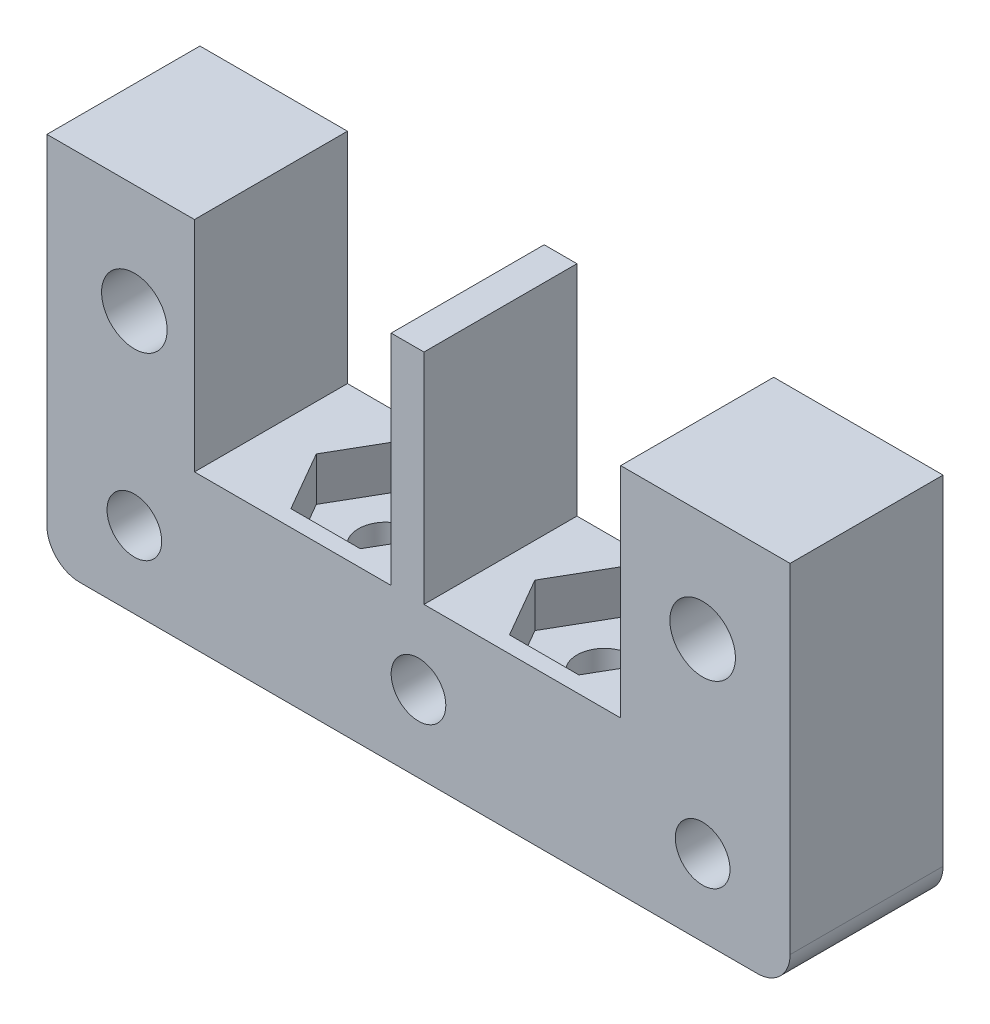
ISO-10303-21;
HEADER;
FILE_DESCRIPTION(('STEP AP214'),'2;1');
FILE_NAME('part.step','',(''),(''),'','','');
FILE_SCHEMA(('AUTOMOTIVE_DESIGN { 1 0 10303 214 1 1 1 1 }'));
ENDSEC;
DATA;
#1=APPLICATION_CONTEXT('core data for automotive mechanical design processes');
#2=APPLICATION_PROTOCOL_DEFINITION('international standard','automotive_design',2000,#1);
#3=PRODUCT_CONTEXT('',#1,'mechanical');
#4=PRODUCT('Part','Part','',(#3));
#5=PRODUCT_RELATED_PRODUCT_CATEGORY('part','',(#4));
#6=PRODUCT_DEFINITION_FORMATION('','',#4);
#7=PRODUCT_DEFINITION_CONTEXT('part definition',#1,'design');
#8=PRODUCT_DEFINITION('design','',#6,#7);
#9=PRODUCT_DEFINITION_SHAPE('','',#8);
#10=(LENGTH_UNIT() NAMED_UNIT(*) SI_UNIT(.MILLI.,.METRE.));
#11=(NAMED_UNIT(*) PLANE_ANGLE_UNIT() SI_UNIT($,.RADIAN.));
#12=(NAMED_UNIT(*) SI_UNIT($,.STERADIAN.) SOLID_ANGLE_UNIT());
#13=UNCERTAINTY_MEASURE_WITH_UNIT(LENGTH_MEASURE(1.E-05),#10,'distance_accuracy_value','');
#14=(GEOMETRIC_REPRESENTATION_CONTEXT(3) GLOBAL_UNCERTAINTY_ASSIGNED_CONTEXT((#13)) GLOBAL_UNIT_ASSIGNED_CONTEXT((#10,
#11,#12)) REPRESENTATION_CONTEXT('',''));
#15=CARTESIAN_POINT('',(0.,0.,0.));
#16=DIRECTION('',(0.,0.,1.));
#17=DIRECTION('',(1.,0.,0.));
#18=AXIS2_PLACEMENT_3D('',#15,#16,#17);
#19=CARTESIAN_POINT('',(12.,10.,-3.5));
#20=DIRECTION('',(0.,-1.,0.));
#21=DIRECTION('',(0.,0.,1.));
#22=AXIS2_PLACEMENT_3D('',#19,#20,#21);
#23=CYLINDRICAL_SURFACE('',#22,1.25);
#24=CARTESIAN_POINT('',(12.,0.,-3.5));
#25=DIRECTION('',(0.,1.,0.));
#26=DIRECTION('',(0.,0.,1.));
#27=AXIS2_PLACEMENT_3D('',#24,#25,#26);
#28=CIRCLE('',#27,1.25);
#29=CARTESIAN_POINT('',(12.,0.,-2.25));
#30=VERTEX_POINT('',#29);
#31=EDGE_CURVE('E379',#30,#30,#28,.T.);
#32=ORIENTED_EDGE('',*,*,#31,.F.);
#33=EDGE_LOOP('',(#32));
#34=FACE_BOUND('',#33,.T.);
#35=CARTESIAN_POINT('',(12.,5.,-3.5));
#36=DIRECTION('',(0.,-1.,0.));
#37=DIRECTION('',(0.,0.,-1.));
#38=AXIS2_PLACEMENT_3D('',#35,#36,#37);
#39=CIRCLE('',#38,1.25);
#40=CARTESIAN_POINT('',(12.,5.,-4.75));
#41=VERTEX_POINT('',#40);
#42=EDGE_CURVE('E334',#41,#41,#39,.F.);
#43=ORIENTED_EDGE('',*,*,#42,.T.);
#44=EDGE_LOOP('',(#43));
#45=FACE_BOUND('',#44,.T.);
#46=ADVANCED_FACE('F35',(#34,#45),#23,.F.);
#47=CARTESIAN_POINT('',(22.,10.,-3.5));
#48=DIRECTION('',(0.,-1.,0.));
#49=DIRECTION('',(0.,0.,1.));
#50=AXIS2_PLACEMENT_3D('',#47,#48,#49);
#51=CYLINDRICAL_SURFACE('',#50,1.25);
#52=CARTESIAN_POINT('',(22.,0.,-3.5));
#53=DIRECTION('',(0.,1.,0.));
#54=DIRECTION('',(0.,0.,1.));
#55=AXIS2_PLACEMENT_3D('',#52,#53,#54);
#56=CIRCLE('',#55,1.25);
#57=CARTESIAN_POINT('',(22.,0.,-2.25));
#58=VERTEX_POINT('',#57);
#59=EDGE_CURVE('E380',#58,#58,#56,.T.);
#60=ORIENTED_EDGE('',*,*,#59,.F.);
#61=EDGE_LOOP('',(#60));
#62=FACE_BOUND('',#61,.T.);
#63=CARTESIAN_POINT('',(22.,5.,-3.5));
#64=DIRECTION('',(0.,-1.,0.));
#65=DIRECTION('',(0.,0.,-1.));
#66=AXIS2_PLACEMENT_3D('',#63,#64,#65);
#67=CIRCLE('',#66,1.25);
#68=CARTESIAN_POINT('',(22.,5.,-4.75));
#69=VERTEX_POINT('',#68);
#70=EDGE_CURVE('E265',#69,#69,#67,.F.);
#71=ORIENTED_EDGE('',*,*,#70,.T.);
#72=EDGE_LOOP('',(#71));
#73=FACE_BOUND('',#72,.T.);
#74=ADVANCED_FACE('F519',(#62,#73),#51,.F.);
#75=CARTESIAN_POINT('',(0.,7.,-7.));
#76=DIRECTION('',(0.,-1.,0.));
#77=DIRECTION('',(0.,0.,1.));
#78=AXIS2_PLACEMENT_3D('',#75,#76,#77);
#79=PLANE('',#78);
#80=DIRECTION('',(-0.500000000000001,0.,0.866025403784438));
#81=VECTOR('',#80,1.);
#82=CARTESIAN_POINT('',(25.1754264805429,7.,-3.5));
#83=LINE('',#82,#81);
#84=CARTESIAN_POINT('',(25.1754264805429,7.,-3.5));
#85=VERTEX_POINT('',#84);
#86=CARTESIAN_POINT('',(23.5877132402715,7.,-0.749999999999997));
#87=VERTEX_POINT('',#86);
#88=EDGE_CURVE('E296',#85,#87,#83,.T.);
#89=ORIENTED_EDGE('',*,*,#88,.T.);
#90=DIRECTION('',(-1.,0.,0.));
#91=VECTOR('',#90,1.);
#92=CARTESIAN_POINT('',(23.5877132402715,7.,-0.749999999999997));
#93=LINE('',#92,#91);
#94=CARTESIAN_POINT('',(20.4122867597285,7.,-0.749999999999998));
#95=VERTEX_POINT('',#94);
#96=EDGE_CURVE('E299',#87,#95,#93,.T.);
#97=ORIENTED_EDGE('',*,*,#96,.T.);
#98=DIRECTION('',(-0.5,0.,-0.866025403784439));
#99=VECTOR('',#98,1.);
#100=CARTESIAN_POINT('',(20.4122867597285,7.,-0.749999999999998));
#101=LINE('',#100,#99);
#102=CARTESIAN_POINT('',(18.8245735194571,7.,-3.5));
#103=VERTEX_POINT('',#102);
#104=EDGE_CURVE('E302',#95,#103,#101,.T.);
#105=ORIENTED_EDGE('',*,*,#104,.T.);
#106=DIRECTION('',(0.5,0.,-0.866025403784438));
#107=VECTOR('',#106,1.);
#108=CARTESIAN_POINT('',(18.8245735194571,7.,-3.5));
#109=LINE('',#108,#107);
#110=CARTESIAN_POINT('',(20.4122867597285,7.,-6.25));
#111=VERTEX_POINT('',#110);
#112=EDGE_CURVE('E305',#103,#111,#109,.T.);
#113=ORIENTED_EDGE('',*,*,#112,.T.);
#114=DIRECTION('',(1.,0.,0.));
#115=VECTOR('',#114,1.);
#116=CARTESIAN_POINT('',(20.4122867597285,7.,-6.25));
#117=LINE('',#116,#115);
#118=CARTESIAN_POINT('',(23.5877132402715,7.,-6.25));
#119=VERTEX_POINT('',#118);
#120=EDGE_CURVE('E277',#111,#119,#117,.T.);
#121=ORIENTED_EDGE('',*,*,#120,.T.);
#122=DIRECTION('',(0.5,0.,0.866025403784438));
#123=VECTOR('',#122,1.);
#124=CARTESIAN_POINT('',(23.5877132402715,7.,-6.25));
#125=LINE('',#124,#123);
#126=EDGE_CURVE('E293',#119,#85,#125,.T.);
#127=ORIENTED_EDGE('',*,*,#126,.T.);
#128=EDGE_LOOP('',(#89,#97,#105,#113,#121,#127));
#129=FACE_BOUND('',#128,.T.);
#130=DIRECTION('',(0.,0.,-1.));
#131=VECTOR('',#130,1.);
#132=CARTESIAN_POINT('',(26.25,7.,0.));
#133=LINE('',#132,#131);
#134=CARTESIAN_POINT('',(26.25,7.,0.));
#135=VERTEX_POINT('',#134);
#136=CARTESIAN_POINT('',(26.25,7.,-7.));
#137=VERTEX_POINT('',#136);
#138=EDGE_CURVE('E323',#135,#137,#133,.T.);
#139=ORIENTED_EDGE('',*,*,#138,.T.);
#140=DIRECTION('',(-1.,0.,0.));
#141=VECTOR('',#140,1.);
#142=CARTESIAN_POINT('',(0.,7.,-7.));
#143=LINE('',#142,#141);
#144=CARTESIAN_POINT('',(17.25,7.,-7.));
#145=VERTEX_POINT('',#144);
#146=EDGE_CURVE('E414',#137,#145,#143,.T.);
#147=ORIENTED_EDGE('',*,*,#146,.T.);
#148=DIRECTION('',(0.,0.,1.));
#149=VECTOR('',#148,1.);
#150=CARTESIAN_POINT('',(17.25,7.,-7.));
#151=LINE('',#150,#149);
#152=CARTESIAN_POINT('',(17.25,7.,0.));
#153=VERTEX_POINT('',#152);
#154=EDGE_CURVE('E342',#145,#153,#151,.T.);
#155=ORIENTED_EDGE('',*,*,#154,.T.);
#156=DIRECTION('',(-1.,0.,0.));
#157=VECTOR('',#156,1.);
#158=CARTESIAN_POINT('',(0.,7.,0.));
#159=LINE('',#158,#157);
#160=EDGE_CURVE('E408',#135,#153,#159,.T.);
#161=ORIENTED_EDGE('',*,*,#160,.F.);
#162=EDGE_LOOP('',(#139,#147,#155,#161));
#163=FACE_BOUND('',#162,.T.);
#164=ADVANCED_FACE('F496',(#129,#163),#79,.F.);
#165=DIRECTION('',(-0.5,0.,0.866025403784439));
#166=VECTOR('',#165,1.);
#167=CARTESIAN_POINT('',(15.1754264805429,7.,-3.49999999999999));
#168=LINE('',#167,#166);
#169=CARTESIAN_POINT('',(15.1754264805429,7.,-3.49999999999999));
#170=VERTEX_POINT('',#169);
#171=CARTESIAN_POINT('',(13.5877132402715,7.,-0.749999999999999));
#172=VERTEX_POINT('',#171);
#173=EDGE_CURVE('E214',#170,#172,#168,.T.);
#174=ORIENTED_EDGE('',*,*,#173,.T.);
#175=DIRECTION('',(-1.,0.,0.));
#176=VECTOR('',#175,1.);
#177=CARTESIAN_POINT('',(13.5877132402715,7.,-0.749999999999999));
#178=LINE('',#177,#176);
#179=CARTESIAN_POINT('',(10.4122867597285,7.,-0.75));
#180=VERTEX_POINT('',#179);
#181=EDGE_CURVE('E256',#172,#180,#178,.T.);
#182=ORIENTED_EDGE('',*,*,#181,.T.);
#183=DIRECTION('',(-0.499999999999999,0.,-0.866025403784439));
#184=VECTOR('',#183,1.);
#185=CARTESIAN_POINT('',(10.4122867597285,7.,-0.75));
#186=LINE('',#185,#184);
#187=CARTESIAN_POINT('',(8.82457351945707,7.,-3.5));
#188=VERTEX_POINT('',#187);
#189=EDGE_CURVE('E259',#180,#188,#186,.T.);
#190=ORIENTED_EDGE('',*,*,#189,.T.);
#191=DIRECTION('',(0.5,0.,-0.866025403784439));
#192=VECTOR('',#191,1.);
#193=CARTESIAN_POINT('',(8.82457351945707,7.,-3.5));
#194=LINE('',#193,#192);
#195=CARTESIAN_POINT('',(10.4122867597285,7.,-6.25));
#196=VERTEX_POINT('',#195);
#197=EDGE_CURVE('E238',#188,#196,#194,.T.);
#198=ORIENTED_EDGE('',*,*,#197,.T.);
#199=DIRECTION('',(1.,0.,0.));
#200=VECTOR('',#199,1.);
#201=CARTESIAN_POINT('',(10.4122867597285,7.,-6.25));
#202=LINE('',#201,#200);
#203=CARTESIAN_POINT('',(13.5877132402715,7.,-6.25));
#204=VERTEX_POINT('',#203);
#205=EDGE_CURVE('E235',#196,#204,#202,.T.);
#206=ORIENTED_EDGE('',*,*,#205,.T.);
#207=DIRECTION('',(0.5,0.,0.866025403784439));
#208=VECTOR('',#207,1.);
#209=CARTESIAN_POINT('',(13.5877132402715,7.,-6.25));
#210=LINE('',#209,#208);
#211=EDGE_CURVE('E252',#204,#170,#210,.T.);
#212=ORIENTED_EDGE('',*,*,#211,.T.);
#213=EDGE_LOOP('',(#174,#182,#190,#198,#206,#212));
#214=FACE_BOUND('',#213,.T.);
#215=DIRECTION('',(0.,0.,-1.));
#216=VECTOR('',#215,1.);
#217=CARTESIAN_POINT('',(15.75,7.,-7.));
#218=LINE('',#217,#216);
#219=CARTESIAN_POINT('',(15.75,7.,0.));
#220=VERTEX_POINT('',#219);
#221=CARTESIAN_POINT('',(15.75,7.,-7.));
#222=VERTEX_POINT('',#221);
#223=EDGE_CURVE('E338',#220,#222,#218,.T.);
#224=ORIENTED_EDGE('',*,*,#223,.T.);
#225=CARTESIAN_POINT('',(6.75,7.,-7.));
#226=VERTEX_POINT('',#225);
#227=EDGE_CURVE('E413',#222,#226,#143,.T.);
#228=ORIENTED_EDGE('',*,*,#227,.T.);
#229=DIRECTION('',(0.,0.,1.));
#230=VECTOR('',#229,1.);
#231=CARTESIAN_POINT('',(6.75,7.,0.));
#232=LINE('',#231,#230);
#233=CARTESIAN_POINT('',(6.75,7.,0.));
#234=VERTEX_POINT('',#233);
#235=EDGE_CURVE('E362',#226,#234,#232,.T.);
#236=ORIENTED_EDGE('',*,*,#235,.T.);
#237=EDGE_CURVE('E426',#220,#234,#159,.T.);
#238=ORIENTED_EDGE('',*,*,#237,.F.);
#239=EDGE_LOOP('',(#224,#228,#236,#238));
#240=FACE_BOUND('',#239,.T.);
#241=ADVANCED_FACE('F476',(#214,#240),#79,.F.);
#242=CARTESIAN_POINT('',(0.,0.,-7.));
#243=DIRECTION('',(0.,0.,-1.));
#244=DIRECTION('',(1.,0.,0.));
#245=AXIS2_PLACEMENT_3D('',#242,#243,#244);
#246=PLANE('',#245);
#247=CARTESIAN_POINT('',(30.,12.,-7.));
#248=DIRECTION('',(0.,0.,1.));
#249=DIRECTION('',(1.,0.,0.));
#250=AXIS2_PLACEMENT_3D('',#247,#248,#249);
#251=CIRCLE('',#250,1.5);
#252=CARTESIAN_POINT('',(31.5,12.,-7.));
#253=VERTEX_POINT('',#252);
#254=EDGE_CURVE('E241',#253,#253,#251,.T.);
#255=ORIENTED_EDGE('',*,*,#254,.T.);
#256=EDGE_LOOP('',(#255));
#257=FACE_BOUND('',#256,.T.);
#258=CARTESIAN_POINT('',(4.,12.,-7.));
#259=DIRECTION('',(0.,0.,1.));
#260=DIRECTION('',(1.,0.,0.));
#261=AXIS2_PLACEMENT_3D('',#258,#259,#260);
#262=CIRCLE('',#261,1.5);
#263=CARTESIAN_POINT('',(5.5,12.,-7.));
#264=VERTEX_POINT('',#263);
#265=EDGE_CURVE('E750',#264,#264,#262,.T.);
#266=ORIENTED_EDGE('',*,*,#265,.T.);
#267=EDGE_LOOP('',(#266));
#268=FACE_BOUND('',#267,.T.);
#269=CARTESIAN_POINT('',(30.,3.50000000000001,-7.));
#270=DIRECTION('',(0.,0.,1.));
#271=DIRECTION('',(1.,0.,0.));
#272=AXIS2_PLACEMENT_3D('',#269,#270,#271);
#273=CIRCLE('',#272,1.25);
#274=CARTESIAN_POINT('',(31.25,3.50000000000001,-7.));
#275=VERTEX_POINT('',#274);
#276=EDGE_CURVE('E392',#275,#275,#273,.T.);
#277=ORIENTED_EDGE('',*,*,#276,.T.);
#278=EDGE_LOOP('',(#277));
#279=FACE_BOUND('',#278,.T.);
#280=DIRECTION('',(0.,-1.,0.));
#281=VECTOR('',#280,1.);
#282=CARTESIAN_POINT('',(0.,7.,-7.));
#283=LINE('',#282,#281);
#284=CARTESIAN_POINT('',(0.,17.,-7.));
#285=VERTEX_POINT('',#284);
#286=CARTESIAN_POINT('',(0.,1.5,-7.));
#287=VERTEX_POINT('',#286);
#288=EDGE_CURVE('E404',#285,#287,#283,.T.);
#289=ORIENTED_EDGE('',*,*,#288,.F.);
#290=DIRECTION('',(1.,0.,0.));
#291=VECTOR('',#290,1.);
#292=CARTESIAN_POINT('',(6.75000000000001,17.,-7.));
#293=LINE('',#292,#291);
#294=CARTESIAN_POINT('',(6.75000000000001,17.,-7.));
#295=VERTEX_POINT('',#294);
#296=EDGE_CURVE('E370',#285,#295,#293,.T.);
#297=ORIENTED_EDGE('',*,*,#296,.T.);
#298=DIRECTION('',(0.,-1.,0.));
#299=VECTOR('',#298,1.);
#300=CARTESIAN_POINT('',(6.75000000000001,17.,-7.));
#301=LINE('',#300,#299);
#302=EDGE_CURVE('E373',#295,#226,#301,.T.);
#303=ORIENTED_EDGE('',*,*,#302,.T.);
#304=ORIENTED_EDGE('',*,*,#227,.F.);
#305=DIRECTION('',(0.,-1.,0.));
#306=VECTOR('',#305,1.);
#307=CARTESIAN_POINT('',(15.75,17.,-7.));
#308=LINE('',#307,#306);
#309=CARTESIAN_POINT('',(15.75,17.,-7.));
#310=VERTEX_POINT('',#309);
#311=EDGE_CURVE('E360',#310,#222,#308,.T.);
#312=ORIENTED_EDGE('',*,*,#311,.F.);
#313=DIRECTION('',(1.,0.,0.));
#314=VECTOR('',#313,1.);
#315=CARTESIAN_POINT('',(15.75,17.,-7.));
#316=LINE('',#315,#314);
#317=CARTESIAN_POINT('',(17.25,17.,-7.));
#318=VERTEX_POINT('',#317);
#319=EDGE_CURVE('E341',#310,#318,#316,.T.);
#320=ORIENTED_EDGE('',*,*,#319,.T.);
#321=DIRECTION('',(0.,-1.,0.));
#322=VECTOR('',#321,1.);
#323=CARTESIAN_POINT('',(17.25,17.,-7.));
#324=LINE('',#323,#322);
#325=EDGE_CURVE('E358',#318,#145,#324,.T.);
#326=ORIENTED_EDGE('',*,*,#325,.T.);
#327=ORIENTED_EDGE('',*,*,#146,.F.);
#328=DIRECTION('',(0.,-1.,0.));
#329=VECTOR('',#328,1.);
#330=CARTESIAN_POINT('',(26.25,17.,-7.00000000000004));
#331=LINE('',#330,#329);
#332=CARTESIAN_POINT('',(26.25,17.,-7.00000000000004));
#333=VERTEX_POINT('',#332);
#334=EDGE_CURVE('E336',#333,#137,#331,.T.);
#335=ORIENTED_EDGE('',*,*,#334,.F.);
#336=DIRECTION('',(1.,0.,0.));
#337=VECTOR('',#336,1.);
#338=CARTESIAN_POINT('',(26.25,17.,-7.00000000000004));
#339=LINE('',#338,#337);
#340=CARTESIAN_POINT('',(34.,17.,-7.00000000000004));
#341=VERTEX_POINT('',#340);
#342=EDGE_CURVE('E322',#333,#341,#339,.T.);
#343=ORIENTED_EDGE('',*,*,#342,.T.);
#344=DIRECTION('',(0.,1.,0.));
#345=VECTOR('',#344,1.);
#346=CARTESIAN_POINT('',(34.,0.,-7.));
#347=LINE('',#346,#345);
#348=CARTESIAN_POINT('',(34.,1.5,-7.));
#349=VERTEX_POINT('',#348);
#350=EDGE_CURVE('E411',#349,#341,#347,.T.);
#351=ORIENTED_EDGE('',*,*,#350,.F.);
#352=CARTESIAN_POINT('',(32.5,1.5,-7.));
#353=DIRECTION('',(0.,0.,1.));
#354=DIRECTION('',(1.,0.,0.));
#355=AXIS2_PLACEMENT_3D('',#352,#353,#354);
#356=CIRCLE('',#355,1.5);
#357=CARTESIAN_POINT('',(32.5,0.,-7.));
#358=VERTEX_POINT('',#357);
#359=EDGE_CURVE('E442',#358,#349,#356,.T.);
#360=ORIENTED_EDGE('',*,*,#359,.F.);
#361=DIRECTION('',(1.,0.,0.));
#362=VECTOR('',#361,1.);
#363=CARTESIAN_POINT('',(0.,0.,-7.));
#364=LINE('',#363,#362);
#365=CARTESIAN_POINT('',(1.5,0.,-7.));
#366=VERTEX_POINT('',#365);
#367=EDGE_CURVE('E407',#366,#358,#364,.T.);
#368=ORIENTED_EDGE('',*,*,#367,.F.);
#369=CARTESIAN_POINT('',(1.5,1.5,-7.));
#370=DIRECTION('',(0.,0.,1.));
#371=DIRECTION('',(1.,0.,0.));
#372=AXIS2_PLACEMENT_3D('',#369,#370,#371);
#373=CIRCLE('',#372,1.5);
#374=EDGE_CURVE('E43',#287,#366,#373,.T.);
#375=ORIENTED_EDGE('',*,*,#374,.F.);
#376=EDGE_LOOP('',(#289,#297,#303,#304,#312,#320,#326,#327,#335,#343,#351,#360,#368,#375));
#377=FACE_BOUND('',#376,.T.);
#378=CARTESIAN_POINT('',(4.,3.5,-7.));
#379=DIRECTION('',(0.,0.,1.));
#380=DIRECTION('',(1.,0.,0.));
#381=AXIS2_PLACEMENT_3D('',#378,#379,#380);
#382=CIRCLE('',#381,1.25);
#383=CARTESIAN_POINT('',(5.25,3.5,-7.));
#384=VERTEX_POINT('',#383);
#385=EDGE_CURVE('E398',#384,#384,#382,.T.);
#386=ORIENTED_EDGE('',*,*,#385,.T.);
#387=EDGE_LOOP('',(#386));
#388=FACE_BOUND('',#387,.T.);
#389=CARTESIAN_POINT('',(17.,3.5,-7.));
#390=DIRECTION('',(0.,0.,1.));
#391=DIRECTION('',(1.,0.,0.));
#392=AXIS2_PLACEMENT_3D('',#389,#390,#391);
#393=CIRCLE('',#392,1.25);
#394=CARTESIAN_POINT('',(18.25,3.5,-7.));
#395=VERTEX_POINT('',#394);
#396=EDGE_CURVE('E386',#395,#395,#393,.T.);
#397=ORIENTED_EDGE('',*,*,#396,.T.);
#398=EDGE_LOOP('',(#397));
#399=FACE_BOUND('',#398,.T.);
#400=ADVANCED_FACE('F449',(#257,#268,#279,#377,#388,#399),#246,.T.);
#401=CARTESIAN_POINT('',(0.,0.,0.));
#402=DIRECTION('',(0.,0.,-1.));
#403=DIRECTION('',(1.,0.,0.));
#404=AXIS2_PLACEMENT_3D('',#401,#402,#403);
#405=PLANE('',#404);
#406=CARTESIAN_POINT('',(30.,12.,0.));
#407=DIRECTION('',(0.,0.,-1.));
#408=DIRECTION('',(-1.,0.,0.));
#409=AXIS2_PLACEMENT_3D('',#406,#407,#408);
#410=CIRCLE('',#409,1.5);
#411=CARTESIAN_POINT('',(28.5,12.,0.));
#412=VERTEX_POINT('',#411);
#413=EDGE_CURVE('E749',#412,#412,#410,.T.);
#414=ORIENTED_EDGE('',*,*,#413,.T.);
#415=EDGE_LOOP('',(#414));
#416=FACE_BOUND('',#415,.T.);
#417=CARTESIAN_POINT('',(4.,12.,0.));
#418=DIRECTION('',(0.,0.,-1.));
#419=DIRECTION('',(-1.,0.,0.));
#420=AXIS2_PLACEMENT_3D('',#417,#418,#419);
#421=CIRCLE('',#420,1.5);
#422=CARTESIAN_POINT('',(2.5,12.,0.));
#423=VERTEX_POINT('',#422);
#424=EDGE_CURVE('E751',#423,#423,#421,.T.);
#425=ORIENTED_EDGE('',*,*,#424,.T.);
#426=EDGE_LOOP('',(#425));
#427=FACE_BOUND('',#426,.T.);
#428=DIRECTION('',(1.,0.,0.));
#429=VECTOR('',#428,1.);
#430=CARTESIAN_POINT('',(0.,0.,0.));
#431=LINE('',#430,#429);
#432=CARTESIAN_POINT('',(1.5,0.,0.));
#433=VERTEX_POINT('',#432);
#434=CARTESIAN_POINT('',(32.5,0.,0.));
#435=VERTEX_POINT('',#434);
#436=EDGE_CURVE('E420',#433,#435,#431,.T.);
#437=ORIENTED_EDGE('',*,*,#436,.T.);
#438=CARTESIAN_POINT('',(32.5,1.5,0.));
#439=DIRECTION('',(0.,0.,1.));
#440=DIRECTION('',(1.,0.,0.));
#441=AXIS2_PLACEMENT_3D('',#438,#439,#440);
#442=CIRCLE('',#441,1.5);
#443=CARTESIAN_POINT('',(34.,1.5,0.));
#444=VERTEX_POINT('',#443);
#445=EDGE_CURVE('E436',#444,#435,#442,.F.);
#446=ORIENTED_EDGE('',*,*,#445,.F.);
#447=DIRECTION('',(0.,1.,0.));
#448=VECTOR('',#447,1.);
#449=CARTESIAN_POINT('',(34.,0.,0.));
#450=LINE('',#449,#448);
#451=CARTESIAN_POINT('',(34.,17.,0.));
#452=VERTEX_POINT('',#451);
#453=EDGE_CURVE('E423',#444,#452,#450,.T.);
#454=ORIENTED_EDGE('',*,*,#453,.T.);
#455=DIRECTION('',(-1.,0.,0.));
#456=VECTOR('',#455,1.);
#457=CARTESIAN_POINT('',(26.25,17.,0.));
#458=LINE('',#457,#456);
#459=CARTESIAN_POINT('',(26.25,17.,0.));
#460=VERTEX_POINT('',#459);
#461=EDGE_CURVE('E328',#452,#460,#458,.T.);
#462=ORIENTED_EDGE('',*,*,#461,.T.);
#463=DIRECTION('',(0.,-1.,0.));
#464=VECTOR('',#463,1.);
#465=CARTESIAN_POINT('',(26.25,17.,0.));
#466=LINE('',#465,#464);
#467=EDGE_CURVE('E331',#460,#135,#466,.T.);
#468=ORIENTED_EDGE('',*,*,#467,.T.);
#469=ORIENTED_EDGE('',*,*,#160,.T.);
#470=DIRECTION('',(0.,-1.,0.));
#471=VECTOR('',#470,1.);
#472=CARTESIAN_POINT('',(17.25,17.,0.));
#473=LINE('',#472,#471);
#474=CARTESIAN_POINT('',(17.25,17.,0.));
#475=VERTEX_POINT('',#474);
#476=EDGE_CURVE('E356',#475,#153,#473,.T.);
#477=ORIENTED_EDGE('',*,*,#476,.F.);
#478=DIRECTION('',(-1.,0.,0.));
#479=VECTOR('',#478,1.);
#480=CARTESIAN_POINT('',(15.75,17.,0.));
#481=LINE('',#480,#479);
#482=CARTESIAN_POINT('',(15.75,17.,0.));
#483=VERTEX_POINT('',#482);
#484=EDGE_CURVE('E347',#475,#483,#481,.T.);
#485=ORIENTED_EDGE('',*,*,#484,.T.);
#486=DIRECTION('',(0.,-1.,0.));
#487=VECTOR('',#486,1.);
#488=CARTESIAN_POINT('',(15.75,17.,0.));
#489=LINE('',#488,#487);
#490=EDGE_CURVE('E350',#483,#220,#489,.T.);
#491=ORIENTED_EDGE('',*,*,#490,.T.);
#492=ORIENTED_EDGE('',*,*,#237,.T.);
#493=DIRECTION('',(0.,-1.,0.));
#494=VECTOR('',#493,1.);
#495=CARTESIAN_POINT('',(6.75,17.,0.));
#496=LINE('',#495,#494);
#497=CARTESIAN_POINT('',(6.75,17.,0.));
#498=VERTEX_POINT('',#497);
#499=EDGE_CURVE('E377',#498,#234,#496,.T.);
#500=ORIENTED_EDGE('',*,*,#499,.F.);
#501=DIRECTION('',(-1.,0.,0.));
#502=VECTOR('',#501,1.);
#503=CARTESIAN_POINT('',(6.75,17.,0.));
#504=LINE('',#503,#502);
#505=CARTESIAN_POINT('',(0.,17.,0.));
#506=VERTEX_POINT('',#505);
#507=EDGE_CURVE('E365',#498,#506,#504,.T.);
#508=ORIENTED_EDGE('',*,*,#507,.T.);
#509=DIRECTION('',(0.,-1.,0.));
#510=VECTOR('',#509,1.);
#511=CARTESIAN_POINT('',(0.,7.,0.));
#512=LINE('',#511,#510);
#513=CARTESIAN_POINT('',(0.,1.5,0.));
#514=VERTEX_POINT('',#513);
#515=EDGE_CURVE('E401',#506,#514,#512,.T.);
#516=ORIENTED_EDGE('',*,*,#515,.T.);
#517=CARTESIAN_POINT('',(1.5,1.5,0.));
#518=DIRECTION('',(0.,0.,1.));
#519=DIRECTION('',(1.,0.,0.));
#520=AXIS2_PLACEMENT_3D('',#517,#518,#519);
#521=CIRCLE('',#520,1.5);
#522=EDGE_CURVE('E439',#433,#514,#521,.F.);
#523=ORIENTED_EDGE('',*,*,#522,.F.);
#524=EDGE_LOOP('',(#437,#446,#454,#462,#468,#469,#477,#485,#491,#492,#500,#508,#516,#523));
#525=FACE_BOUND('',#524,.T.);
#526=CARTESIAN_POINT('',(4.,3.5,0.));
#527=DIRECTION('',(0.,0.,1.));
#528=DIRECTION('',(1.,0.,0.));
#529=AXIS2_PLACEMENT_3D('',#526,#527,#528);
#530=CIRCLE('',#529,1.25);
#531=CARTESIAN_POINT('',(5.25,3.5,0.));
#532=VERTEX_POINT('',#531);
#533=EDGE_CURVE('E395',#532,#532,#530,.T.);
#534=ORIENTED_EDGE('',*,*,#533,.F.);
#535=EDGE_LOOP('',(#534));
#536=FACE_BOUND('',#535,.T.);
#537=CARTESIAN_POINT('',(30.,3.50000000000001,0.));
#538=DIRECTION('',(0.,0.,1.));
#539=DIRECTION('',(1.,0.,0.));
#540=AXIS2_PLACEMENT_3D('',#537,#538,#539);
#541=CIRCLE('',#540,1.25);
#542=CARTESIAN_POINT('',(31.25,3.50000000000001,0.));
#543=VERTEX_POINT('',#542);
#544=EDGE_CURVE('E389',#543,#543,#541,.T.);
#545=ORIENTED_EDGE('',*,*,#544,.F.);
#546=EDGE_LOOP('',(#545));
#547=FACE_BOUND('',#546,.T.);
#548=CARTESIAN_POINT('',(17.,3.5,0.));
#549=DIRECTION('',(0.,0.,1.));
#550=DIRECTION('',(1.,0.,0.));
#551=AXIS2_PLACEMENT_3D('',#548,#549,#550);
#552=CIRCLE('',#551,1.25);
#553=CARTESIAN_POINT('',(18.25,3.5,0.));
#554=VERTEX_POINT('',#553);
#555=EDGE_CURVE('E383',#554,#554,#552,.T.);
#556=ORIENTED_EDGE('',*,*,#555,.F.);
#557=EDGE_LOOP('',(#556));
#558=FACE_BOUND('',#557,.T.);
#559=ADVANCED_FACE('F457',(#416,#427,#525,#536,#547,#558),#405,.F.);
#560=CARTESIAN_POINT('',(0.,7.,-7.));
#561=DIRECTION('',(1.,0.,0.));
#562=DIRECTION('',(0.,0.,1.));
#563=AXIS2_PLACEMENT_3D('',#560,#561,#562);
#564=PLANE('',#563);
#565=ORIENTED_EDGE('',*,*,#515,.F.);
#566=DIRECTION('',(0.,0.,-1.));
#567=VECTOR('',#566,1.);
#568=CARTESIAN_POINT('',(0.,17.,0.));
#569=LINE('',#568,#567);
#570=EDGE_CURVE('E368',#506,#285,#569,.T.);
#571=ORIENTED_EDGE('',*,*,#570,.T.);
#572=ORIENTED_EDGE('',*,*,#288,.T.);
#573=DIRECTION('',(0.,0.,1.));
#574=VECTOR('',#573,1.);
#575=CARTESIAN_POINT('',(0.,1.5,-7.));
#576=LINE('',#575,#574);
#577=EDGE_CURVE('E56',#514,#287,#576,.F.);
#578=ORIENTED_EDGE('',*,*,#577,.F.);
#579=EDGE_LOOP('',(#565,#571,#572,#578));
#580=FACE_BOUND('',#579,.T.);
#581=ADVANCED_FACE('F463',(#580),#564,.F.);
#582=CARTESIAN_POINT('',(0.,0.,-7.));
#583=DIRECTION('',(0.,1.,0.));
#584=DIRECTION('',(0.,0.,-1.));
#585=AXIS2_PLACEMENT_3D('',#582,#583,#584);
#586=PLANE('',#585);
#587=ORIENTED_EDGE('',*,*,#59,.T.);
#588=EDGE_LOOP('',(#587));
#589=FACE_BOUND('',#588,.T.);
#590=ORIENTED_EDGE('',*,*,#31,.T.);
#591=EDGE_LOOP('',(#590));
#592=FACE_BOUND('',#591,.T.);
#593=ORIENTED_EDGE('',*,*,#367,.T.);
#594=DIRECTION('',(0.,0.,1.));
#595=VECTOR('',#594,1.);
#596=CARTESIAN_POINT('',(32.5,0.,-7.));
#597=LINE('',#596,#595);
#598=EDGE_CURVE('E417',#435,#358,#597,.F.);
#599=ORIENTED_EDGE('',*,*,#598,.F.);
#600=ORIENTED_EDGE('',*,*,#436,.F.);
#601=DIRECTION('',(0.,0.,1.));
#602=VECTOR('',#601,1.);
#603=CARTESIAN_POINT('',(1.5,0.,-7.));
#604=LINE('',#603,#602);
#605=EDGE_CURVE('E434',#366,#433,#604,.T.);
#606=ORIENTED_EDGE('',*,*,#605,.F.);
#607=EDGE_LOOP('',(#593,#599,#600,#606));
#608=FACE_BOUND('',#607,.T.);
#609=ADVANCED_FACE('F453',(#589,#592,#608),#586,.F.);
#610=CARTESIAN_POINT('',(34.,0.,-7.));
#611=DIRECTION('',(-1.,0.,0.));
#612=DIRECTION('',(0.,0.,-1.));
#613=AXIS2_PLACEMENT_3D('',#610,#611,#612);
#614=PLANE('',#613);
#615=ORIENTED_EDGE('',*,*,#350,.T.);
#616=DIRECTION('',(0.,0.,1.));
#617=VECTOR('',#616,1.);
#618=CARTESIAN_POINT('',(34.,17.,0.));
#619=LINE('',#618,#617);
#620=EDGE_CURVE('E326',#341,#452,#619,.T.);
#621=ORIENTED_EDGE('',*,*,#620,.T.);
#622=ORIENTED_EDGE('',*,*,#453,.F.);
#623=DIRECTION('',(0.,0.,1.));
#624=VECTOR('',#623,1.);
#625=CARTESIAN_POINT('',(34.,1.5,-7.));
#626=LINE('',#625,#624);
#627=EDGE_CURVE('E11',#349,#444,#626,.T.);
#628=ORIENTED_EDGE('',*,*,#627,.F.);
#629=EDGE_LOOP('',(#615,#621,#622,#628));
#630=FACE_BOUND('',#629,.T.);
#631=ADVANCED_FACE('F504',(#630),#614,.F.);
#632=CARTESIAN_POINT('',(4.,3.5,-7.));
#633=DIRECTION('',(0.,0.,1.));
#634=DIRECTION('',(-1.,0.,0.));
#635=AXIS2_PLACEMENT_3D('',#632,#633,#634);
#636=CYLINDRICAL_SURFACE('',#635,1.25);
#637=ORIENTED_EDGE('',*,*,#385,.F.);
#638=EDGE_LOOP('',(#637));
#639=FACE_BOUND('',#638,.T.);
#640=ORIENTED_EDGE('',*,*,#533,.T.);
#641=EDGE_LOOP('',(#640));
#642=FACE_BOUND('',#641,.T.);
#643=ADVANCED_FACE('F506',(#639,#642),#636,.F.);
#644=CARTESIAN_POINT('',(30.,3.50000000000001,-7.));
#645=DIRECTION('',(0.,0.,1.));
#646=DIRECTION('',(-1.,0.,0.));
#647=AXIS2_PLACEMENT_3D('',#644,#645,#646);
#648=CYLINDRICAL_SURFACE('',#647,1.25);
#649=ORIENTED_EDGE('',*,*,#276,.F.);
#650=EDGE_LOOP('',(#649));
#651=FACE_BOUND('',#650,.T.);
#652=ORIENTED_EDGE('',*,*,#544,.T.);
#653=EDGE_LOOP('',(#652));
#654=FACE_BOUND('',#653,.T.);
#655=ADVANCED_FACE('F512',(#651,#654),#648,.F.);
#656=CARTESIAN_POINT('',(17.,3.5,-7.));
#657=DIRECTION('',(0.,0.,1.));
#658=DIRECTION('',(-1.,0.,0.));
#659=AXIS2_PLACEMENT_3D('',#656,#657,#658);
#660=CYLINDRICAL_SURFACE('',#659,1.25);
#661=ORIENTED_EDGE('',*,*,#396,.F.);
#662=EDGE_LOOP('',(#661));
#663=FACE_BOUND('',#662,.T.);
#664=ORIENTED_EDGE('',*,*,#555,.T.);
#665=EDGE_LOOP('',(#664));
#666=FACE_BOUND('',#665,.T.);
#667=ADVANCED_FACE('F531',(#663,#666),#660,.F.);
#668=CARTESIAN_POINT('',(6.75,17.,0.));
#669=DIRECTION('',(-1.,0.,0.));
#670=DIRECTION('',(0.,0.,-1.));
#671=AXIS2_PLACEMENT_3D('',#668,#669,#670);
#672=PLANE('',#671);
#673=ORIENTED_EDGE('',*,*,#235,.F.);
#674=ORIENTED_EDGE('',*,*,#302,.F.);
#675=DIRECTION('',(0.,0.,1.));
#676=VECTOR('',#675,1.);
#677=CARTESIAN_POINT('',(6.75,17.,0.));
#678=LINE('',#677,#676);
#679=EDGE_CURVE('E363',#295,#498,#678,.T.);
#680=ORIENTED_EDGE('',*,*,#679,.T.);
#681=ORIENTED_EDGE('',*,*,#499,.T.);
#682=EDGE_LOOP('',(#673,#674,#680,#681));
#683=FACE_BOUND('',#682,.T.);
#684=ADVANCED_FACE('F471',(#683),#672,.F.);
#685=CARTESIAN_POINT('',(0.,17.,0.));
#686=DIRECTION('',(0.,-1.,0.));
#687=DIRECTION('',(0.,0.,1.));
#688=AXIS2_PLACEMENT_3D('',#685,#686,#687);
#689=PLANE('',#688);
#690=ORIENTED_EDGE('',*,*,#679,.F.);
#691=ORIENTED_EDGE('',*,*,#296,.F.);
#692=ORIENTED_EDGE('',*,*,#570,.F.);
#693=ORIENTED_EDGE('',*,*,#507,.F.);
#694=EDGE_LOOP('',(#690,#691,#692,#693));
#695=FACE_BOUND('',#694,.T.);
#696=ADVANCED_FACE('F469',(#695),#689,.F.);
#697=CARTESIAN_POINT('',(15.75,17.,-7.));
#698=DIRECTION('',(1.,0.,0.));
#699=DIRECTION('',(0.,0.,1.));
#700=AXIS2_PLACEMENT_3D('',#697,#698,#699);
#701=PLANE('',#700);
#702=ORIENTED_EDGE('',*,*,#223,.F.);
#703=ORIENTED_EDGE('',*,*,#490,.F.);
#704=DIRECTION('',(0.,0.,-1.));
#705=VECTOR('',#704,1.);
#706=CARTESIAN_POINT('',(15.75,17.,-7.));
#707=LINE('',#706,#705);
#708=EDGE_CURVE('E339',#483,#310,#707,.T.);
#709=ORIENTED_EDGE('',*,*,#708,.T.);
#710=ORIENTED_EDGE('',*,*,#311,.T.);
#711=EDGE_LOOP('',(#702,#703,#709,#710));
#712=FACE_BOUND('',#711,.T.);
#713=ADVANCED_FACE('F481',(#712),#701,.F.);
#714=CARTESIAN_POINT('',(17.25,17.,-7.));
#715=DIRECTION('',(-1.,0.,0.));
#716=DIRECTION('',(0.,0.,-1.));
#717=AXIS2_PLACEMENT_3D('',#714,#715,#716);
#718=PLANE('',#717);
#719=ORIENTED_EDGE('',*,*,#154,.F.);
#720=ORIENTED_EDGE('',*,*,#325,.F.);
#721=DIRECTION('',(0.,0.,1.));
#722=VECTOR('',#721,1.);
#723=CARTESIAN_POINT('',(17.25,17.,-7.));
#724=LINE('',#723,#722);
#725=EDGE_CURVE('E345',#318,#475,#724,.T.);
#726=ORIENTED_EDGE('',*,*,#725,.T.);
#727=ORIENTED_EDGE('',*,*,#476,.T.);
#728=EDGE_LOOP('',(#719,#720,#726,#727));
#729=FACE_BOUND('',#728,.T.);
#730=ADVANCED_FACE('F490',(#729),#718,.F.);
#731=CARTESIAN_POINT('',(0.,17.,0.));
#732=DIRECTION('',(0.,-1.,0.));
#733=DIRECTION('',(0.,0.,1.));
#734=AXIS2_PLACEMENT_3D('',#731,#732,#733);
#735=PLANE('',#734);
#736=ORIENTED_EDGE('',*,*,#708,.F.);
#737=ORIENTED_EDGE('',*,*,#484,.F.);
#738=ORIENTED_EDGE('',*,*,#725,.F.);
#739=ORIENTED_EDGE('',*,*,#319,.F.);
#740=EDGE_LOOP('',(#736,#737,#738,#739));
#741=FACE_BOUND('',#740,.T.);
#742=ADVANCED_FACE('F485',(#741),#735,.F.);
#743=CARTESIAN_POINT('',(26.25,17.,0.));
#744=DIRECTION('',(1.,0.,0.));
#745=DIRECTION('',(0.,0.,1.));
#746=AXIS2_PLACEMENT_3D('',#743,#744,#745);
#747=PLANE('',#746);
#748=ORIENTED_EDGE('',*,*,#138,.F.);
#749=ORIENTED_EDGE('',*,*,#467,.F.);
#750=DIRECTION('',(0.,0.,-1.));
#751=VECTOR('',#750,1.);
#752=CARTESIAN_POINT('',(26.25,17.,0.));
#753=LINE('',#752,#751);
#754=EDGE_CURVE('E320',#460,#333,#753,.T.);
#755=ORIENTED_EDGE('',*,*,#754,.T.);
#756=ORIENTED_EDGE('',*,*,#334,.T.);
#757=EDGE_LOOP('',(#748,#749,#755,#756));
#758=FACE_BOUND('',#757,.T.);
#759=ADVANCED_FACE('F499',(#758),#747,.F.);
#760=CARTESIAN_POINT('',(0.,17.,0.));
#761=DIRECTION('',(0.,1.,0.));
#762=DIRECTION('',(0.,0.,-1.));
#763=AXIS2_PLACEMENT_3D('',#760,#761,#762);
#764=PLANE('',#763);
#765=ORIENTED_EDGE('',*,*,#754,.F.);
#766=ORIENTED_EDGE('',*,*,#461,.F.);
#767=ORIENTED_EDGE('',*,*,#620,.F.);
#768=ORIENTED_EDGE('',*,*,#342,.F.);
#769=EDGE_LOOP('',(#765,#766,#767,#768));
#770=FACE_BOUND('',#769,.T.);
#771=ADVANCED_FACE('F503',(#770),#764,.T.);
#772=CARTESIAN_POINT('',(0.,5.,0.));
#773=DIRECTION('',(0.,1.,0.));
#774=DIRECTION('',(0.,0.,-1.));
#775=AXIS2_PLACEMENT_3D('',#772,#773,#774);
#776=PLANE('',#775);
#777=DIRECTION('',(0.5,0.,0.866025403784438));
#778=VECTOR('',#777,1.);
#779=CARTESIAN_POINT('',(23.5877132402715,5.,-6.25));
#780=LINE('',#779,#778);
#781=CARTESIAN_POINT('',(23.5877132402715,5.,-6.25));
#782=VERTEX_POINT('',#781);
#783=CARTESIAN_POINT('',(25.1754264805429,5.,-3.5));
#784=VERTEX_POINT('',#783);
#785=EDGE_CURVE('E273',#782,#784,#780,.T.);
#786=ORIENTED_EDGE('',*,*,#785,.F.);
#787=DIRECTION('',(1.,0.,0.));
#788=VECTOR('',#787,1.);
#789=CARTESIAN_POINT('',(20.4122867597285,5.,-6.25));
#790=LINE('',#789,#788);
#791=CARTESIAN_POINT('',(20.4122867597285,5.,-6.25));
#792=VERTEX_POINT('',#791);
#793=EDGE_CURVE('E289',#792,#782,#790,.T.);
#794=ORIENTED_EDGE('',*,*,#793,.F.);
#795=DIRECTION('',(0.5,0.,-0.866025403784438));
#796=VECTOR('',#795,1.);
#797=CARTESIAN_POINT('',(18.8245735194571,5.,-3.5));
#798=LINE('',#797,#796);
#799=CARTESIAN_POINT('',(18.8245735194571,5.,-3.5));
#800=VERTEX_POINT('',#799);
#801=EDGE_CURVE('E286',#800,#792,#798,.T.);
#802=ORIENTED_EDGE('',*,*,#801,.F.);
#803=DIRECTION('',(-0.5,0.,-0.866025403784439));
#804=VECTOR('',#803,1.);
#805=CARTESIAN_POINT('',(20.4122867597285,5.,-0.749999999999998));
#806=LINE('',#805,#804);
#807=CARTESIAN_POINT('',(20.4122867597285,5.,-0.749999999999998));
#808=VERTEX_POINT('',#807);
#809=EDGE_CURVE('E283',#808,#800,#806,.T.);
#810=ORIENTED_EDGE('',*,*,#809,.F.);
#811=DIRECTION('',(-1.,0.,0.));
#812=VECTOR('',#811,1.);
#813=CARTESIAN_POINT('',(23.5877132402715,5.,-0.749999999999997));
#814=LINE('',#813,#812);
#815=CARTESIAN_POINT('',(23.5877132402715,5.,-0.749999999999997));
#816=VERTEX_POINT('',#815);
#817=EDGE_CURVE('E280',#816,#808,#814,.T.);
#818=ORIENTED_EDGE('',*,*,#817,.F.);
#819=DIRECTION('',(-0.500000000000001,0.,0.866025403784438));
#820=VECTOR('',#819,1.);
#821=CARTESIAN_POINT('',(25.1754264805429,5.,-3.5));
#822=LINE('',#821,#820);
#823=EDGE_CURVE('E276',#784,#816,#822,.T.);
#824=ORIENTED_EDGE('',*,*,#823,.F.);
#825=EDGE_LOOP('',(#786,#794,#802,#810,#818,#824));
#826=FACE_BOUND('',#825,.T.);
#827=ORIENTED_EDGE('',*,*,#70,.F.);
#828=EDGE_LOOP('',(#827));
#829=FACE_BOUND('',#828,.T.);
#830=ADVANCED_FACE('F574',(#826,#829),#776,.T.);
#831=CARTESIAN_POINT('',(23.5877132402715,5.,-6.25));
#832=DIRECTION('',(0.866025403784438,0.,-0.5));
#833=DIRECTION('',(0.5,0.,0.866025403784438));
#834=AXIS2_PLACEMENT_3D('',#831,#832,#833);
#835=PLANE('',#834);
#836=ORIENTED_EDGE('',*,*,#126,.F.);
#837=DIRECTION('',(0.,1.,0.));
#838=VECTOR('',#837,1.);
#839=CARTESIAN_POINT('',(23.5877132402715,5.,-6.25));
#840=LINE('',#839,#838);
#841=EDGE_CURVE('E254',#782,#119,#840,.T.);
#842=ORIENTED_EDGE('',*,*,#841,.F.);
#843=ORIENTED_EDGE('',*,*,#785,.T.);
#844=DIRECTION('',(0.,1.,0.));
#845=VECTOR('',#844,1.);
#846=CARTESIAN_POINT('',(25.1754264805429,5.,-3.5));
#847=LINE('',#846,#845);
#848=EDGE_CURVE('E292',#784,#85,#847,.T.);
#849=ORIENTED_EDGE('',*,*,#848,.T.);
#850=EDGE_LOOP('',(#836,#842,#843,#849));
#851=FACE_BOUND('',#850,.T.);
#852=ADVANCED_FACE('F577',(#851),#835,.F.);
#853=CARTESIAN_POINT('',(20.4122867597285,5.,-6.25));
#854=DIRECTION('',(0.,0.,-1.));
#855=DIRECTION('',(1.,0.,0.));
#856=AXIS2_PLACEMENT_3D('',#853,#854,#855);
#857=PLANE('',#856);
#858=ORIENTED_EDGE('',*,*,#120,.F.);
#859=DIRECTION('',(0.,1.,0.));
#860=VECTOR('',#859,1.);
#861=CARTESIAN_POINT('',(20.4122867597285,5.,-6.25));
#862=LINE('',#861,#860);
#863=EDGE_CURVE('E311',#792,#111,#862,.T.);
#864=ORIENTED_EDGE('',*,*,#863,.F.);
#865=ORIENTED_EDGE('',*,*,#793,.T.);
#866=ORIENTED_EDGE('',*,*,#841,.T.);
#867=EDGE_LOOP('',(#858,#864,#865,#866));
#868=FACE_BOUND('',#867,.T.);
#869=ADVANCED_FACE('F579',(#868),#857,.F.);
#870=CARTESIAN_POINT('',(18.8245735194571,5.,-3.5));
#871=DIRECTION('',(-0.866025403784438,0.,-0.5));
#872=DIRECTION('',(0.5,0.,-0.866025403784438));
#873=AXIS2_PLACEMENT_3D('',#870,#871,#872);
#874=PLANE('',#873);
#875=ORIENTED_EDGE('',*,*,#112,.F.);
#876=DIRECTION('',(0.,1.,0.));
#877=VECTOR('',#876,1.);
#878=CARTESIAN_POINT('',(18.8245735194571,5.,-3.5));
#879=LINE('',#878,#877);
#880=EDGE_CURVE('E313',#800,#103,#879,.T.);
#881=ORIENTED_EDGE('',*,*,#880,.F.);
#882=ORIENTED_EDGE('',*,*,#801,.T.);
#883=ORIENTED_EDGE('',*,*,#863,.T.);
#884=EDGE_LOOP('',(#875,#881,#882,#883));
#885=FACE_BOUND('',#884,.T.);
#886=ADVANCED_FACE('F582',(#885),#874,.F.);
#887=CARTESIAN_POINT('',(20.4122867597285,5.,-0.749999999999998));
#888=DIRECTION('',(-0.866025403784439,0.,0.5));
#889=DIRECTION('',(-0.5,0.,-0.866025403784439));
#890=AXIS2_PLACEMENT_3D('',#887,#888,#889);
#891=PLANE('',#890);
#892=ORIENTED_EDGE('',*,*,#104,.F.);
#893=DIRECTION('',(0.,1.,0.));
#894=VECTOR('',#893,1.);
#895=CARTESIAN_POINT('',(20.4122867597285,5.,-0.749999999999998));
#896=LINE('',#895,#894);
#897=EDGE_CURVE('E315',#808,#95,#896,.T.);
#898=ORIENTED_EDGE('',*,*,#897,.F.);
#899=ORIENTED_EDGE('',*,*,#809,.T.);
#900=ORIENTED_EDGE('',*,*,#880,.T.);
#901=EDGE_LOOP('',(#892,#898,#899,#900));
#902=FACE_BOUND('',#901,.T.);
#903=ADVANCED_FACE('F586',(#902),#891,.F.);
#904=CARTESIAN_POINT('',(23.5877132402715,5.,-0.749999999999997));
#905=DIRECTION('',(0.,0.,1.));
#906=DIRECTION('',(-1.,0.,0.));
#907=AXIS2_PLACEMENT_3D('',#904,#905,#906);
#908=PLANE('',#907);
#909=ORIENTED_EDGE('',*,*,#96,.F.);
#910=DIRECTION('',(0.,1.,0.));
#911=VECTOR('',#910,1.);
#912=CARTESIAN_POINT('',(23.5877132402715,5.,-0.749999999999997));
#913=LINE('',#912,#911);
#914=EDGE_CURVE('E317',#816,#87,#913,.T.);
#915=ORIENTED_EDGE('',*,*,#914,.F.);
#916=ORIENTED_EDGE('',*,*,#817,.T.);
#917=ORIENTED_EDGE('',*,*,#897,.T.);
#918=EDGE_LOOP('',(#909,#915,#916,#917));
#919=FACE_BOUND('',#918,.T.);
#920=ADVANCED_FACE('F590',(#919),#908,.F.);
#921=CARTESIAN_POINT('',(25.1754264805429,5.,-3.5));
#922=DIRECTION('',(0.866025403784438,0.,0.500000000000001));
#923=DIRECTION('',(-0.500000000000001,0.,0.866025403784438));
#924=AXIS2_PLACEMENT_3D('',#921,#922,#923);
#925=PLANE('',#924);
#926=ORIENTED_EDGE('',*,*,#88,.F.);
#927=ORIENTED_EDGE('',*,*,#848,.F.);
#928=ORIENTED_EDGE('',*,*,#823,.T.);
#929=ORIENTED_EDGE('',*,*,#914,.T.);
#930=EDGE_LOOP('',(#926,#927,#928,#929));
#931=FACE_BOUND('',#930,.T.);
#932=ADVANCED_FACE('F594',(#931),#925,.F.);
#933=CARTESIAN_POINT('',(0.,5.,0.));
#934=DIRECTION('',(0.,1.,0.));
#935=DIRECTION('',(0.,0.,-1.));
#936=AXIS2_PLACEMENT_3D('',#933,#934,#935);
#937=PLANE('',#936);
#938=DIRECTION('',(0.5,0.,0.866025403784439));
#939=VECTOR('',#938,1.);
#940=CARTESIAN_POINT('',(13.5877132402715,5.,-6.25));
#941=LINE('',#940,#939);
#942=CARTESIAN_POINT('',(13.5877132402715,5.,-6.25));
#943=VERTEX_POINT('',#942);
#944=CARTESIAN_POINT('',(15.1754264805429,5.,-3.49999999999999));
#945=VERTEX_POINT('',#944);
#946=EDGE_CURVE('E227',#943,#945,#941,.T.);
#947=ORIENTED_EDGE('',*,*,#946,.F.);
#948=DIRECTION('',(1.,0.,0.));
#949=VECTOR('',#948,1.);
#950=CARTESIAN_POINT('',(10.4122867597285,5.,-6.25));
#951=LINE('',#950,#949);
#952=CARTESIAN_POINT('',(10.4122867597285,5.,-6.25));
#953=VERTEX_POINT('',#952);
#954=EDGE_CURVE('E220',#953,#943,#951,.T.);
#955=ORIENTED_EDGE('',*,*,#954,.F.);
#956=DIRECTION('',(0.5,0.,-0.866025403784439));
#957=VECTOR('',#956,1.);
#958=CARTESIAN_POINT('',(8.82457351945707,5.,-3.5));
#959=LINE('',#958,#957);
#960=CARTESIAN_POINT('',(8.82457351945707,5.,-3.5));
#961=VERTEX_POINT('',#960);
#962=EDGE_CURVE('E248',#961,#953,#959,.T.);
#963=ORIENTED_EDGE('',*,*,#962,.F.);
#964=DIRECTION('',(-0.499999999999999,0.,-0.866025403784439));
#965=VECTOR('',#964,1.);
#966=CARTESIAN_POINT('',(10.4122867597285,5.,-0.75));
#967=LINE('',#966,#965);
#968=CARTESIAN_POINT('',(10.4122867597285,5.,-0.75));
#969=VERTEX_POINT('',#968);
#970=EDGE_CURVE('E245',#969,#961,#967,.T.);
#971=ORIENTED_EDGE('',*,*,#970,.F.);
#972=DIRECTION('',(-1.,0.,0.));
#973=VECTOR('',#972,1.);
#974=CARTESIAN_POINT('',(13.5877132402715,5.,-0.749999999999999));
#975=LINE('',#974,#973);
#976=CARTESIAN_POINT('',(13.5877132402715,5.,-0.749999999999999));
#977=VERTEX_POINT('',#976);
#978=EDGE_CURVE('E230',#977,#969,#975,.T.);
#979=ORIENTED_EDGE('',*,*,#978,.F.);
#980=DIRECTION('',(-0.5,0.,0.866025403784439));
#981=VECTOR('',#980,1.);
#982=CARTESIAN_POINT('',(15.1754264805429,5.,-3.49999999999999));
#983=LINE('',#982,#981);
#984=EDGE_CURVE('E211',#945,#977,#983,.T.);
#985=ORIENTED_EDGE('',*,*,#984,.F.);
#986=EDGE_LOOP('',(#947,#955,#963,#971,#979,#985));
#987=FACE_BOUND('',#986,.T.);
#988=ORIENTED_EDGE('',*,*,#42,.F.);
#989=EDGE_LOOP('',(#988));
#990=FACE_BOUND('',#989,.T.);
#991=ADVANCED_FACE('F224',(#987,#990),#937,.T.);
#992=CARTESIAN_POINT('',(13.5877132402715,5.,-6.25));
#993=DIRECTION('',(0.866025403784439,0.,-0.5));
#994=DIRECTION('',(0.5,0.,0.866025403784439));
#995=AXIS2_PLACEMENT_3D('',#992,#993,#994);
#996=PLANE('',#995);
#997=ORIENTED_EDGE('',*,*,#211,.F.);
#998=DIRECTION('',(0.,1.,0.));
#999=VECTOR('',#998,1.);
#1000=CARTESIAN_POINT('',(13.5877132402715,5.,-6.25));
#1001=LINE('',#1000,#999);
#1002=EDGE_CURVE('E233',#943,#204,#1001,.T.);
#1003=ORIENTED_EDGE('',*,*,#1002,.F.);
#1004=ORIENTED_EDGE('',*,*,#946,.T.);
#1005=DIRECTION('',(0.,1.,0.));
#1006=VECTOR('',#1005,1.);
#1007=CARTESIAN_POINT('',(15.1754264805429,5.,-3.49999999999999));
#1008=LINE('',#1007,#1006);
#1009=EDGE_CURVE('E208',#945,#170,#1008,.T.);
#1010=ORIENTED_EDGE('',*,*,#1009,.T.);
#1011=EDGE_LOOP('',(#997,#1003,#1004,#1010));
#1012=FACE_BOUND('',#1011,.T.);
#1013=ADVANCED_FACE('F232',(#1012),#996,.F.);
#1014=CARTESIAN_POINT('',(10.4122867597285,5.,-6.25));
#1015=DIRECTION('',(0.,0.,-1.));
#1016=DIRECTION('',(1.,0.,0.));
#1017=AXIS2_PLACEMENT_3D('',#1014,#1015,#1016);
#1018=PLANE('',#1017);
#1019=ORIENTED_EDGE('',*,*,#205,.F.);
#1020=DIRECTION('',(0.,1.,0.));
#1021=VECTOR('',#1020,1.);
#1022=CARTESIAN_POINT('',(10.4122867597285,5.,-6.25));
#1023=LINE('',#1022,#1021);
#1024=EDGE_CURVE('E266',#953,#196,#1023,.T.);
#1025=ORIENTED_EDGE('',*,*,#1024,.F.);
#1026=ORIENTED_EDGE('',*,*,#954,.T.);
#1027=ORIENTED_EDGE('',*,*,#1002,.T.);
#1028=EDGE_LOOP('',(#1019,#1025,#1026,#1027));
#1029=FACE_BOUND('',#1028,.T.);
#1030=ADVANCED_FACE('F553',(#1029),#1018,.F.);
#1031=CARTESIAN_POINT('',(8.82457351945707,5.,-3.5));
#1032=DIRECTION('',(-0.866025403784439,0.,-0.5));
#1033=DIRECTION('',(0.5,0.,-0.866025403784439));
#1034=AXIS2_PLACEMENT_3D('',#1031,#1032,#1033);
#1035=PLANE('',#1034);
#1036=ORIENTED_EDGE('',*,*,#197,.F.);
#1037=DIRECTION('',(0.,1.,0.));
#1038=VECTOR('',#1037,1.);
#1039=CARTESIAN_POINT('',(8.82457351945707,5.,-3.5));
#1040=LINE('',#1039,#1038);
#1041=EDGE_CURVE('E268',#961,#188,#1040,.T.);
#1042=ORIENTED_EDGE('',*,*,#1041,.F.);
#1043=ORIENTED_EDGE('',*,*,#962,.T.);
#1044=ORIENTED_EDGE('',*,*,#1024,.T.);
#1045=EDGE_LOOP('',(#1036,#1042,#1043,#1044));
#1046=FACE_BOUND('',#1045,.T.);
#1047=ADVANCED_FACE('F556',(#1046),#1035,.F.);
#1048=CARTESIAN_POINT('',(10.4122867597285,5.,-0.75));
#1049=DIRECTION('',(-0.866025403784439,0.,0.499999999999999));
#1050=DIRECTION('',(-0.499999999999999,0.,-0.866025403784439));
#1051=AXIS2_PLACEMENT_3D('',#1048,#1049,#1050);
#1052=PLANE('',#1051);
#1053=ORIENTED_EDGE('',*,*,#189,.F.);
#1054=DIRECTION('',(0.,1.,0.));
#1055=VECTOR('',#1054,1.);
#1056=CARTESIAN_POINT('',(10.4122867597285,5.,-0.75));
#1057=LINE('',#1056,#1055);
#1058=EDGE_CURVE('E270',#969,#180,#1057,.T.);
#1059=ORIENTED_EDGE('',*,*,#1058,.F.);
#1060=ORIENTED_EDGE('',*,*,#970,.T.);
#1061=ORIENTED_EDGE('',*,*,#1041,.T.);
#1062=EDGE_LOOP('',(#1053,#1059,#1060,#1061));
#1063=FACE_BOUND('',#1062,.T.);
#1064=ADVANCED_FACE('F559',(#1063),#1052,.F.);
#1065=CARTESIAN_POINT('',(13.5877132402715,5.,-0.749999999999999));
#1066=DIRECTION('',(0.,0.,1.));
#1067=DIRECTION('',(-1.,0.,0.));
#1068=AXIS2_PLACEMENT_3D('',#1065,#1066,#1067);
#1069=PLANE('',#1068);
#1070=ORIENTED_EDGE('',*,*,#181,.F.);
#1071=DIRECTION('',(0.,1.,0.));
#1072=VECTOR('',#1071,1.);
#1073=CARTESIAN_POINT('',(13.5877132402715,5.,-0.749999999999999));
#1074=LINE('',#1073,#1072);
#1075=EDGE_CURVE('E219',#977,#172,#1074,.T.);
#1076=ORIENTED_EDGE('',*,*,#1075,.F.);
#1077=ORIENTED_EDGE('',*,*,#978,.T.);
#1078=ORIENTED_EDGE('',*,*,#1058,.T.);
#1079=EDGE_LOOP('',(#1070,#1076,#1077,#1078));
#1080=FACE_BOUND('',#1079,.T.);
#1081=ADVANCED_FACE('F561',(#1080),#1069,.F.);
#1082=CARTESIAN_POINT('',(15.1754264805429,5.,-3.49999999999999));
#1083=DIRECTION('',(0.866025403784439,0.,0.5));
#1084=DIRECTION('',(-0.5,0.,0.866025403784439));
#1085=AXIS2_PLACEMENT_3D('',#1082,#1083,#1084);
#1086=PLANE('',#1085);
#1087=ORIENTED_EDGE('',*,*,#173,.F.);
#1088=ORIENTED_EDGE('',*,*,#1009,.F.);
#1089=ORIENTED_EDGE('',*,*,#984,.T.);
#1090=ORIENTED_EDGE('',*,*,#1075,.T.);
#1091=EDGE_LOOP('',(#1087,#1088,#1089,#1090));
#1092=FACE_BOUND('',#1091,.T.);
#1093=ADVANCED_FACE('F210',(#1092),#1086,.F.);
#1094=CARTESIAN_POINT('',(1.5,1.5,-7.));
#1095=DIRECTION('',(0.,0.,1.));
#1096=DIRECTION('',(-1.,0.,0.));
#1097=AXIS2_PLACEMENT_3D('',#1094,#1095,#1096);
#1098=CYLINDRICAL_SURFACE('',#1097,1.5);
#1099=ORIENTED_EDGE('',*,*,#374,.T.);
#1100=ORIENTED_EDGE('',*,*,#605,.T.);
#1101=ORIENTED_EDGE('',*,*,#522,.T.);
#1102=ORIENTED_EDGE('',*,*,#577,.T.);
#1103=EDGE_LOOP('',(#1099,#1100,#1101,#1102));
#1104=FACE_BOUND('',#1103,.T.);
#1105=ADVANCED_FACE('F444',(#1104),#1098,.T.);
#1106=CARTESIAN_POINT('',(32.5,1.5,-7.));
#1107=DIRECTION('',(0.,0.,1.));
#1108=DIRECTION('',(-1.,0.,0.));
#1109=AXIS2_PLACEMENT_3D('',#1106,#1107,#1108);
#1110=CYLINDRICAL_SURFACE('',#1109,1.5);
#1111=ORIENTED_EDGE('',*,*,#359,.T.);
#1112=ORIENTED_EDGE('',*,*,#627,.T.);
#1113=ORIENTED_EDGE('',*,*,#445,.T.);
#1114=ORIENTED_EDGE('',*,*,#598,.T.);
#1115=EDGE_LOOP('',(#1111,#1112,#1113,#1114));
#1116=FACE_BOUND('',#1115,.T.);
#1117=ADVANCED_FACE('F37',(#1116),#1110,.T.);
#1118=CARTESIAN_POINT('',(4.,12.,-10.));
#1119=DIRECTION('',(0.,0.,1.));
#1120=DIRECTION('',(-1.,0.,0.));
#1121=AXIS2_PLACEMENT_3D('',#1118,#1119,#1120);
#1122=CYLINDRICAL_SURFACE('',#1121,1.5);
#1123=ORIENTED_EDGE('',*,*,#265,.F.);
#1124=EDGE_LOOP('',(#1123));
#1125=FACE_BOUND('',#1124,.T.);
#1126=ORIENTED_EDGE('',*,*,#424,.F.);
#1127=EDGE_LOOP('',(#1126));
#1128=FACE_BOUND('',#1127,.T.);
#1129=ADVANCED_FACE('F721',(#1125,#1128),#1122,.F.);
#1130=CARTESIAN_POINT('',(30.,12.,-10.));
#1131=DIRECTION('',(0.,0.,1.));
#1132=DIRECTION('',(-1.,0.,0.));
#1133=AXIS2_PLACEMENT_3D('',#1130,#1131,#1132);
#1134=CYLINDRICAL_SURFACE('',#1133,1.5);
#1135=ORIENTED_EDGE('',*,*,#254,.F.);
#1136=EDGE_LOOP('',(#1135));
#1137=FACE_BOUND('',#1136,.T.);
#1138=ORIENTED_EDGE('',*,*,#413,.F.);
#1139=EDGE_LOOP('',(#1138));
#1140=FACE_BOUND('',#1139,.T.);
#1141=ADVANCED_FACE('F730',(#1137,#1140),#1134,.F.);
#1142=CLOSED_SHELL('',(#46,#74,#164,#241,#400,#559,#581,#609,#631,#643,#655,#667,#684,#696,#713,
#730,#742,#759,#771,#830,#852,#869,#886,#903,#920,#932,#991,#1013,#1030,#1047,#1064,#1081,#1093,
#1105,#1117,#1129,#1141));
#1143=MANIFOLD_SOLID_BREP('B2',#1142);
#1144=ADVANCED_BREP_SHAPE_REPRESENTATION('',(#18,#1143),#14);
#1145=SHAPE_DEFINITION_REPRESENTATION(#9,#1144);
ENDSEC;
END-ISO-10303-21;
